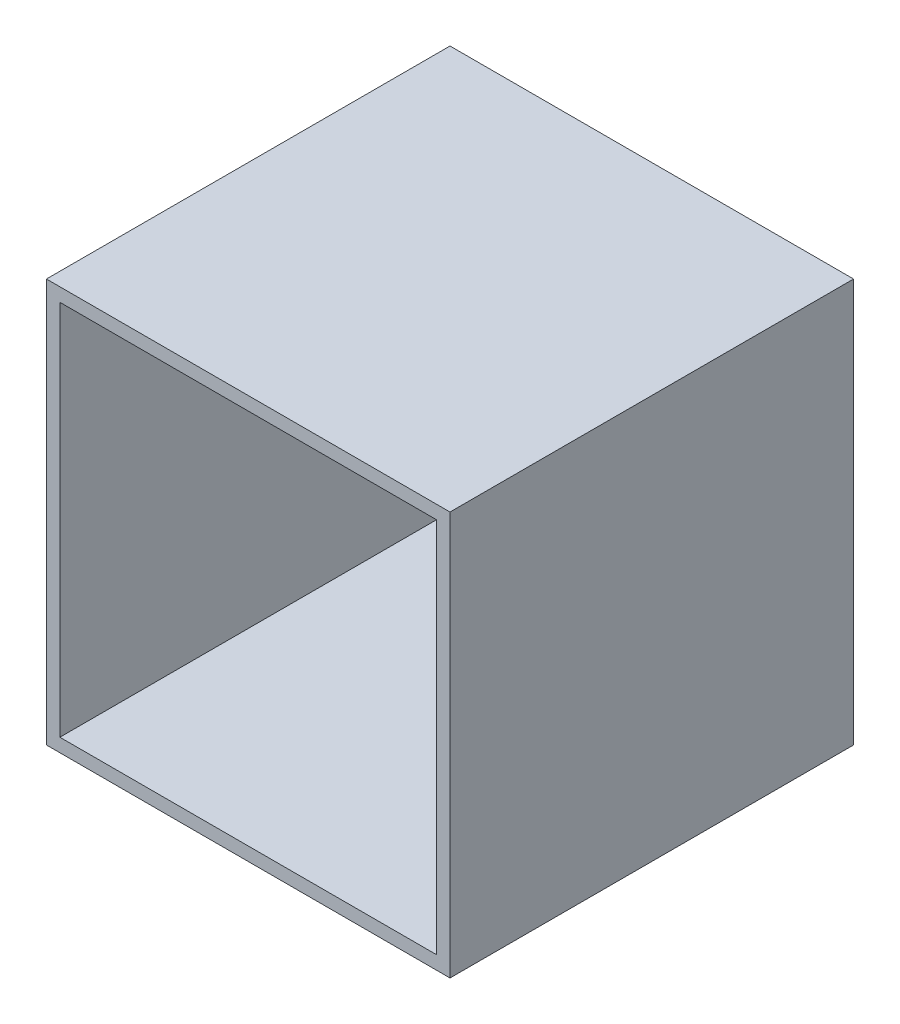
ISO-10303-21;
HEADER;
FILE_DESCRIPTION(('STEP AP214'),'2;1');
FILE_NAME('part.step','',(''),(''),'','','');
FILE_SCHEMA(('AUTOMOTIVE_DESIGN { 1 0 10303 214 1 1 1 1 }'));
ENDSEC;
DATA;
#1=APPLICATION_CONTEXT('core data for automotive mechanical design processes');
#2=APPLICATION_PROTOCOL_DEFINITION('international standard','automotive_design',2000,#1);
#3=PRODUCT_CONTEXT('',#1,'mechanical');
#4=PRODUCT('Part','Part','',(#3));
#5=PRODUCT_RELATED_PRODUCT_CATEGORY('part','',(#4));
#6=PRODUCT_DEFINITION_FORMATION('','',#4);
#7=PRODUCT_DEFINITION_CONTEXT('part definition',#1,'design');
#8=PRODUCT_DEFINITION('design','',#6,#7);
#9=PRODUCT_DEFINITION_SHAPE('','',#8);
#10=(LENGTH_UNIT() NAMED_UNIT(*) SI_UNIT(.MILLI.,.METRE.));
#11=(NAMED_UNIT(*) PLANE_ANGLE_UNIT() SI_UNIT($,.RADIAN.));
#12=(NAMED_UNIT(*) SI_UNIT($,.STERADIAN.) SOLID_ANGLE_UNIT());
#13=UNCERTAINTY_MEASURE_WITH_UNIT(LENGTH_MEASURE(1.E-05),#10,'distance_accuracy_value','');
#14=(GEOMETRIC_REPRESENTATION_CONTEXT(3) GLOBAL_UNCERTAINTY_ASSIGNED_CONTEXT((#13)) GLOBAL_UNIT_ASSIGNED_CONTEXT((#10,
#11,#12)) REPRESENTATION_CONTEXT('',''));
#15=CARTESIAN_POINT('',(0.,0.,0.));
#16=DIRECTION('',(0.,0.,1.));
#17=DIRECTION('',(1.,0.,0.));
#18=AXIS2_PLACEMENT_3D('',#15,#16,#17);
#19=CARTESIAN_POINT('',(-38.1,76.2,38.1));
#20=DIRECTION('',(0.,0.,-1.));
#21=DIRECTION('',(-1.,0.,0.));
#22=AXIS2_PLACEMENT_3D('',#19,#20,#21);
#23=PLANE('',#22);
#24=DIRECTION('',(1.,0.,0.));
#25=VECTOR('',#24,1.);
#26=CARTESIAN_POINT('',(-38.1,0.,38.1));
#27=LINE('',#26,#25);
#28=CARTESIAN_POINT('',(-38.1,0.,38.1));
#29=VERTEX_POINT('',#28);
#30=CARTESIAN_POINT('',(38.1,0.,38.1));
#31=VERTEX_POINT('',#30);
#32=EDGE_CURVE('E380',#29,#31,#27,.T.);
#33=ORIENTED_EDGE('',*,*,#32,.T.);
#34=DIRECTION('',(0.,-1.,0.));
#35=VECTOR('',#34,1.);
#36=CARTESIAN_POINT('',(38.1,76.2,38.1));
#37=LINE('',#36,#35);
#38=CARTESIAN_POINT('',(38.1,76.2,38.1));
#39=VERTEX_POINT('',#38);
#40=EDGE_CURVE('E386',#39,#31,#37,.T.);
#41=ORIENTED_EDGE('',*,*,#40,.F.);
#42=DIRECTION('',(1.,0.,0.));
#43=VECTOR('',#42,1.);
#44=CARTESIAN_POINT('',(-38.1,76.2,38.1));
#45=LINE('',#44,#43);
#46=CARTESIAN_POINT('',(-38.1,76.2,38.1));
#47=VERTEX_POINT('',#46);
#48=EDGE_CURVE('E384',#47,#39,#45,.T.);
#49=ORIENTED_EDGE('',*,*,#48,.F.);
#50=DIRECTION('',(0.,-1.,0.));
#51=VECTOR('',#50,1.);
#52=CARTESIAN_POINT('',(-38.1,76.2,38.1));
#53=LINE('',#52,#51);
#54=EDGE_CURVE('E396',#47,#29,#53,.T.);
#55=ORIENTED_EDGE('',*,*,#54,.T.);
#56=EDGE_LOOP('',(#33,#41,#49,#55));
#57=FACE_BOUND('',#56,.T.);
#58=DIRECTION('',(1.,0.,0.));
#59=VECTOR('',#58,1.);
#60=CARTESIAN_POINT('',(0.,2.54,38.1));
#61=LINE('',#60,#59);
#62=CARTESIAN_POINT('',(-35.56,2.54,38.1));
#63=VERTEX_POINT('',#62);
#64=CARTESIAN_POINT('',(35.56,2.54,38.1));
#65=VERTEX_POINT('',#64);
#66=EDGE_CURVE('E356',#63,#65,#61,.T.);
#67=ORIENTED_EDGE('',*,*,#66,.F.);
#68=DIRECTION('',(0.,-1.,0.));
#69=VECTOR('',#68,1.);
#70=CARTESIAN_POINT('',(-35.56,76.2,38.1));
#71=LINE('',#70,#69);
#72=CARTESIAN_POINT('',(-35.56,73.66,38.1));
#73=VERTEX_POINT('',#72);
#74=EDGE_CURVE('E361',#73,#63,#71,.T.);
#75=ORIENTED_EDGE('',*,*,#74,.F.);
#76=DIRECTION('',(1.,0.,0.));
#77=VECTOR('',#76,1.);
#78=CARTESIAN_POINT('',(0.,73.66,38.1));
#79=LINE('',#78,#77);
#80=CARTESIAN_POINT('',(35.56,73.66,38.1));
#81=VERTEX_POINT('',#80);
#82=EDGE_CURVE('E367',#73,#81,#79,.T.);
#83=ORIENTED_EDGE('',*,*,#82,.T.);
#84=DIRECTION('',(0.,-1.,0.));
#85=VECTOR('',#84,1.);
#86=CARTESIAN_POINT('',(35.56,76.2,38.1));
#87=LINE('',#86,#85);
#88=EDGE_CURVE('E368',#81,#65,#87,.T.);
#89=ORIENTED_EDGE('',*,*,#88,.T.);
#90=EDGE_LOOP('',(#67,#75,#83,#89));
#91=FACE_BOUND('',#90,.T.);
#92=ADVANCED_FACE('F33',(#57,#91),#23,.F.);
#93=CARTESIAN_POINT('',(38.1,76.2,38.1));
#94=DIRECTION('',(-1.,0.,0.));
#95=DIRECTION('',(0.,0.,1.));
#96=AXIS2_PLACEMENT_3D('',#93,#94,#95);
#97=PLANE('',#96);
#98=DIRECTION('',(0.,0.,-1.));
#99=VECTOR('',#98,1.);
#100=CARTESIAN_POINT('',(38.1,0.,38.1));
#101=LINE('',#100,#99);
#102=CARTESIAN_POINT('',(38.1,0.,-38.1));
#103=VERTEX_POINT('',#102);
#104=EDGE_CURVE('E350',#31,#103,#101,.T.);
#105=ORIENTED_EDGE('',*,*,#104,.T.);
#106=DIRECTION('',(0.,-1.,0.));
#107=VECTOR('',#106,1.);
#108=CARTESIAN_POINT('',(38.1,76.2,-38.1));
#109=LINE('',#108,#107);
#110=CARTESIAN_POINT('',(38.1,76.2,-38.1));
#111=VERTEX_POINT('',#110);
#112=EDGE_CURVE('E11',#111,#103,#109,.T.);
#113=ORIENTED_EDGE('',*,*,#112,.F.);
#114=DIRECTION('',(0.,0.,-1.));
#115=VECTOR('',#114,1.);
#116=CARTESIAN_POINT('',(38.1,76.2,38.1));
#117=LINE('',#116,#115);
#118=EDGE_CURVE('E376',#39,#111,#117,.T.);
#119=ORIENTED_EDGE('',*,*,#118,.F.);
#120=ORIENTED_EDGE('',*,*,#40,.T.);
#121=EDGE_LOOP('',(#105,#113,#119,#120));
#122=FACE_BOUND('',#121,.T.);
#123=ADVANCED_FACE('F35',(#122),#97,.F.);
#124=CARTESIAN_POINT('',(-38.1,76.2,-38.1));
#125=DIRECTION('',(0.,0.,1.));
#126=DIRECTION('',(1.,0.,0.));
#127=AXIS2_PLACEMENT_3D('',#124,#125,#126);
#128=PLANE('',#127);
#129=CARTESIAN_POINT('',(-21.336,43.0506780316477,-38.1));
#130=DIRECTION('',(0.,0.,-1.));
#131=DIRECTION('',(-1.,0.,0.));
#132=AXIS2_PLACEMENT_3D('',#129,#130,#131);
#133=CIRCLE('',#132,12.7);
#134=CARTESIAN_POINT('',(-34.036,43.0506780316477,-38.1));
#135=VERTEX_POINT('',#134);
#136=EDGE_CURVE('E569',#135,#135,#133,.T.);
#137=ORIENTED_EDGE('',*,*,#136,.F.);
#138=EDGE_LOOP('',(#137));
#139=FACE_BOUND('',#138,.T.);
#140=DIRECTION('',(0.,-1.,0.));
#141=VECTOR('',#140,1.);
#142=CARTESIAN_POINT('',(9.64770580411888,19.05,-38.1));
#143=LINE('',#142,#141);
#144=CARTESIAN_POINT('',(9.64770580411888,25.4,-38.1));
#145=VERTEX_POINT('',#144);
#146=CARTESIAN_POINT('',(9.64770580411888,19.05,-38.1));
#147=VERTEX_POINT('',#146);
#148=EDGE_CURVE('E251',#145,#147,#143,.T.);
#149=ORIENTED_EDGE('',*,*,#148,.F.);
#150=DIRECTION('',(1.,0.,0.));
#151=VECTOR('',#150,1.);
#152=CARTESIAN_POINT('',(9.64770580411888,25.4,-38.1));
#153=LINE('',#152,#151);
#154=CARTESIAN_POINT('',(3.29770580411888,25.4,-38.1));
#155=VERTEX_POINT('',#154);
#156=EDGE_CURVE('E48',#155,#145,#153,.T.);
#157=ORIENTED_EDGE('',*,*,#156,.F.);
#158=DIRECTION('',(0.,-1.,0.));
#159=VECTOR('',#158,1.);
#160=CARTESIAN_POINT('',(3.29770580411888,25.4,-38.1));
#161=LINE('',#160,#159);
#162=CARTESIAN_POINT('',(3.29770580411888,31.75,-38.1));
#163=VERTEX_POINT('',#162);
#164=EDGE_CURVE('E216',#163,#155,#161,.T.);
#165=ORIENTED_EDGE('',*,*,#164,.F.);
#166=DIRECTION('',(1.,0.,0.));
#167=VECTOR('',#166,1.);
#168=CARTESIAN_POINT('',(3.29770580411888,31.75,-38.1));
#169=LINE('',#168,#167);
#170=CARTESIAN_POINT('',(-3.05229419588112,31.75,-38.1));
#171=VERTEX_POINT('',#170);
#172=EDGE_CURVE('E219',#171,#163,#169,.T.);
#173=ORIENTED_EDGE('',*,*,#172,.F.);
#174=DIRECTION('',(0.,1.,0.));
#175=VECTOR('',#174,1.);
#176=CARTESIAN_POINT('',(-3.05229419588112,31.75,-38.1));
#177=LINE('',#176,#175);
#178=CARTESIAN_POINT('',(-3.05229419588112,25.4,-38.1));
#179=VERTEX_POINT('',#178);
#180=EDGE_CURVE('E275',#179,#171,#177,.T.);
#181=ORIENTED_EDGE('',*,*,#180,.F.);
#182=DIRECTION('',(1.,0.,0.));
#183=VECTOR('',#182,1.);
#184=CARTESIAN_POINT('',(-3.05229419588112,25.4,-38.1));
#185=LINE('',#184,#183);
#186=CARTESIAN_POINT('',(-9.40229419588112,25.4,-38.1));
#187=VERTEX_POINT('',#186);
#188=EDGE_CURVE('E272',#187,#179,#185,.T.);
#189=ORIENTED_EDGE('',*,*,#188,.F.);
#190=DIRECTION('',(0.,1.,0.));
#191=VECTOR('',#190,1.);
#192=CARTESIAN_POINT('',(-9.40229419588112,25.4,-38.1));
#193=LINE('',#192,#191);
#194=CARTESIAN_POINT('',(-9.40229419588112,19.05,-38.1));
#195=VERTEX_POINT('',#194);
#196=EDGE_CURVE('E269',#195,#187,#193,.T.);
#197=ORIENTED_EDGE('',*,*,#196,.F.);
#198=DIRECTION('',(-1.,0.,0.));
#199=VECTOR('',#198,1.);
#200=CARTESIAN_POINT('',(-9.40229419588112,19.05,-38.1));
#201=LINE('',#200,#199);
#202=CARTESIAN_POINT('',(-3.05229419588112,19.05,-38.1));
#203=VERTEX_POINT('',#202);
#204=EDGE_CURVE('E266',#203,#195,#201,.T.);
#205=ORIENTED_EDGE('',*,*,#204,.F.);
#206=DIRECTION('',(0.,1.,0.));
#207=VECTOR('',#206,1.);
#208=CARTESIAN_POINT('',(-3.05229419588112,19.05,-38.1));
#209=LINE('',#208,#207);
#210=CARTESIAN_POINT('',(-3.05229419588112,12.7,-38.1));
#211=VERTEX_POINT('',#210);
#212=EDGE_CURVE('E263',#211,#203,#209,.T.);
#213=ORIENTED_EDGE('',*,*,#212,.F.);
#214=DIRECTION('',(-1.,0.,0.));
#215=VECTOR('',#214,1.);
#216=CARTESIAN_POINT('',(-3.05229419588112,12.7,-38.1));
#217=LINE('',#216,#215);
#218=CARTESIAN_POINT('',(3.29770580411888,12.7,-38.1));
#219=VERTEX_POINT('',#218);
#220=EDGE_CURVE('E260',#219,#211,#217,.T.);
#221=ORIENTED_EDGE('',*,*,#220,.F.);
#222=DIRECTION('',(0.,-1.,0.));
#223=VECTOR('',#222,1.);
#224=CARTESIAN_POINT('',(3.29770580411888,12.7,-38.1));
#225=LINE('',#224,#223);
#226=CARTESIAN_POINT('',(3.29770580411888,19.05,-38.1));
#227=VERTEX_POINT('',#226);
#228=EDGE_CURVE('E257',#227,#219,#225,.T.);
#229=ORIENTED_EDGE('',*,*,#228,.F.);
#230=DIRECTION('',(-1.,0.,0.));
#231=VECTOR('',#230,1.);
#232=CARTESIAN_POINT('',(3.29770580411888,19.05,-38.1));
#233=LINE('',#232,#231);
#234=EDGE_CURVE('E254',#147,#227,#233,.T.);
#235=ORIENTED_EDGE('',*,*,#234,.F.);
#236=EDGE_LOOP('',(#149,#157,#165,#173,#181,#189,#197,#205,#213,#221,#229,#235));
#237=FACE_BOUND('',#236,.T.);
#238=CARTESIAN_POINT('',(0.,57.15,-38.1));
#239=DIRECTION('',(0.,0.,-1.));
#240=DIRECTION('',(-1.,0.,0.));
#241=AXIS2_PLACEMENT_3D('',#238,#239,#240);
#242=CIRCLE('',#241,6.35);
#243=CARTESIAN_POINT('',(-6.35,57.15,-38.1));
#244=VERTEX_POINT('',#243);
#245=EDGE_CURVE('E305',#244,#244,#242,.T.);
#246=ORIENTED_EDGE('',*,*,#245,.F.);
#247=EDGE_LOOP('',(#246));
#248=FACE_BOUND('',#247,.T.);
#249=DIRECTION('',(0.,1.,0.));
#250=VECTOR('',#249,1.);
#251=CARTESIAN_POINT('',(21.59,69.85,-38.1));
#252=LINE('',#251,#250);
#253=CARTESIAN_POINT('',(21.59,6.35000000000001,-38.1));
#254=VERTEX_POINT('',#253);
#255=CARTESIAN_POINT('',(21.59,69.85,-38.1));
#256=VERTEX_POINT('',#255);
#257=EDGE_CURVE('E316',#254,#256,#252,.T.);
#258=ORIENTED_EDGE('',*,*,#257,.F.);
#259=DIRECTION('',(-1.,0.,0.));
#260=VECTOR('',#259,1.);
#261=CARTESIAN_POINT('',(27.94,6.35000000000001,-38.1));
#262=LINE('',#261,#260);
#263=CARTESIAN_POINT('',(27.94,6.35000000000001,-38.1));
#264=VERTEX_POINT('',#263);
#265=EDGE_CURVE('E319',#264,#254,#262,.T.);
#266=ORIENTED_EDGE('',*,*,#265,.F.);
#267=DIRECTION('',(0.,-1.,0.));
#268=VECTOR('',#267,1.);
#269=CARTESIAN_POINT('',(27.94,69.85,-38.1));
#270=LINE('',#269,#268);
#271=CARTESIAN_POINT('',(27.94,69.85,-38.1));
#272=VERTEX_POINT('',#271);
#273=EDGE_CURVE('E311',#272,#264,#270,.T.);
#274=ORIENTED_EDGE('',*,*,#273,.F.);
#275=DIRECTION('',(1.,0.,0.));
#276=VECTOR('',#275,1.);
#277=CARTESIAN_POINT('',(27.94,69.85,-38.1));
#278=LINE('',#277,#276);
#279=EDGE_CURVE('E56',#256,#272,#278,.T.);
#280=ORIENTED_EDGE('',*,*,#279,.F.);
#281=EDGE_LOOP('',(#258,#266,#274,#280));
#282=FACE_BOUND('',#281,.T.);
#283=DIRECTION('',(-1.,0.,0.));
#284=VECTOR('',#283,1.);
#285=CARTESIAN_POINT('',(-38.1,0.,-38.1));
#286=LINE('',#285,#284);
#287=CARTESIAN_POINT('',(-38.1,0.,-38.1));
#288=VERTEX_POINT('',#287);
#289=EDGE_CURVE('E389',#103,#288,#286,.T.);
#290=ORIENTED_EDGE('',*,*,#289,.T.);
#291=DIRECTION('',(0.,-1.,0.));
#292=VECTOR('',#291,1.);
#293=CARTESIAN_POINT('',(-38.1,76.2,-38.1));
#294=LINE('',#293,#292);
#295=CARTESIAN_POINT('',(-38.1,76.2,-38.1));
#296=VERTEX_POINT('',#295);
#297=EDGE_CURVE('E41',#296,#288,#294,.T.);
#298=ORIENTED_EDGE('',*,*,#297,.F.);
#299=DIRECTION('',(-1.,0.,0.));
#300=VECTOR('',#299,1.);
#301=CARTESIAN_POINT('',(-38.1,76.2,-38.1));
#302=LINE('',#301,#300);
#303=EDGE_CURVE('E379',#111,#296,#302,.T.);
#304=ORIENTED_EDGE('',*,*,#303,.F.);
#305=ORIENTED_EDGE('',*,*,#112,.T.);
#306=EDGE_LOOP('',(#290,#298,#304,#305));
#307=FACE_BOUND('',#306,.T.);
#308=ADVANCED_FACE('F419',(#139,#237,#248,#282,#307),#128,.F.);
#309=CARTESIAN_POINT('',(-38.1,76.2,38.1));
#310=DIRECTION('',(1.,0.,0.));
#311=DIRECTION('',(0.,0.,-1.));
#312=AXIS2_PLACEMENT_3D('',#309,#310,#311);
#313=PLANE('',#312);
#314=DIRECTION('',(0.,0.,1.));
#315=VECTOR('',#314,1.);
#316=CARTESIAN_POINT('',(-38.1,0.,38.1));
#317=LINE('',#316,#315);
#318=EDGE_CURVE('E391',#288,#29,#317,.T.);
#319=ORIENTED_EDGE('',*,*,#318,.T.);
#320=ORIENTED_EDGE('',*,*,#54,.F.);
#321=DIRECTION('',(0.,0.,1.));
#322=VECTOR('',#321,1.);
#323=CARTESIAN_POINT('',(-38.1,76.2,38.1));
#324=LINE('',#323,#322);
#325=EDGE_CURVE('E382',#296,#47,#324,.T.);
#326=ORIENTED_EDGE('',*,*,#325,.F.);
#327=ORIENTED_EDGE('',*,*,#297,.T.);
#328=EDGE_LOOP('',(#319,#320,#326,#327));
#329=FACE_BOUND('',#328,.T.);
#330=ADVANCED_FACE('F403',(#329),#313,.F.);
#331=CARTESIAN_POINT('',(0.,76.2,0.));
#332=DIRECTION('',(0.,-1.,0.));
#333=DIRECTION('',(0.,0.,-1.));
#334=AXIS2_PLACEMENT_3D('',#331,#332,#333);
#335=PLANE('',#334);
#336=ORIENTED_EDGE('',*,*,#118,.T.);
#337=ORIENTED_EDGE('',*,*,#303,.T.);
#338=ORIENTED_EDGE('',*,*,#325,.T.);
#339=ORIENTED_EDGE('',*,*,#48,.T.);
#340=EDGE_LOOP('',(#336,#337,#338,#339));
#341=FACE_BOUND('',#340,.T.);
#342=ADVANCED_FACE('F418',(#341),#335,.F.);
#343=CARTESIAN_POINT('',(0.,0.,0.));
#344=DIRECTION('',(0.,-1.,0.));
#345=DIRECTION('',(0.,0.,-1.));
#346=AXIS2_PLACEMENT_3D('',#343,#344,#345);
#347=PLANE('',#346);
#348=ORIENTED_EDGE('',*,*,#104,.F.);
#349=ORIENTED_EDGE('',*,*,#32,.F.);
#350=ORIENTED_EDGE('',*,*,#318,.F.);
#351=ORIENTED_EDGE('',*,*,#289,.F.);
#352=EDGE_LOOP('',(#348,#349,#350,#351));
#353=FACE_BOUND('',#352,.T.);
#354=ADVANCED_FACE('F409',(#353),#347,.T.);
#355=CARTESIAN_POINT('',(35.56,76.2,38.1));
#356=DIRECTION('',(-1.,0.,0.));
#357=DIRECTION('',(0.,0.,1.));
#358=AXIS2_PLACEMENT_3D('',#355,#356,#357);
#359=PLANE('',#358);
#360=DIRECTION('',(0.,0.,-1.));
#361=VECTOR('',#360,1.);
#362=CARTESIAN_POINT('',(35.56,2.54,0.));
#363=LINE('',#362,#361);
#364=CARTESIAN_POINT('',(35.56,2.54,-35.56));
#365=VERTEX_POINT('',#364);
#366=EDGE_CURVE('E343',#65,#365,#363,.T.);
#367=ORIENTED_EDGE('',*,*,#366,.F.);
#368=ORIENTED_EDGE('',*,*,#88,.F.);
#369=DIRECTION('',(0.,0.,-1.));
#370=VECTOR('',#369,1.);
#371=CARTESIAN_POINT('',(35.56,73.66,0.));
#372=LINE('',#371,#370);
#373=CARTESIAN_POINT('',(35.56,73.66,-35.56));
#374=VERTEX_POINT('',#373);
#375=EDGE_CURVE('E352',#81,#374,#372,.T.);
#376=ORIENTED_EDGE('',*,*,#375,.T.);
#377=DIRECTION('',(0.,-1.,0.));
#378=VECTOR('',#377,1.);
#379=CARTESIAN_POINT('',(35.56,76.2,-35.56));
#380=LINE('',#379,#378);
#381=EDGE_CURVE('E347',#374,#365,#380,.T.);
#382=ORIENTED_EDGE('',*,*,#381,.T.);
#383=EDGE_LOOP('',(#367,#368,#376,#382));
#384=FACE_BOUND('',#383,.T.);
#385=ADVANCED_FACE('F436',(#384),#359,.T.);
#386=CARTESIAN_POINT('',(-38.1,76.2,-35.56));
#387=DIRECTION('',(0.,0.,1.));
#388=DIRECTION('',(1.,0.,0.));
#389=AXIS2_PLACEMENT_3D('',#386,#387,#388);
#390=PLANE('',#389);
#391=CARTESIAN_POINT('',(-21.336,43.0506780316477,-35.56));
#392=DIRECTION('',(0.,0.,-1.));
#393=DIRECTION('',(-1.,0.,0.));
#394=AXIS2_PLACEMENT_3D('',#391,#392,#393);
#395=CIRCLE('',#394,3.175);
#396=CARTESIAN_POINT('',(-24.511,43.0506780316477,-35.56));
#397=VERTEX_POINT('',#396);
#398=EDGE_CURVE('E564',#397,#397,#395,.T.);
#399=ORIENTED_EDGE('',*,*,#398,.T.);
#400=EDGE_LOOP('',(#399));
#401=FACE_BOUND('',#400,.T.);
#402=CARTESIAN_POINT('',(6.47270580411888,22.225,-35.56));
#403=DIRECTION('',(0.,0.,-1.));
#404=DIRECTION('',(-1.,0.,0.));
#405=AXIS2_PLACEMENT_3D('',#402,#403,#404);
#406=CIRCLE('',#405,1.397);
#407=CARTESIAN_POINT('',(5.07570580411888,22.225,-35.56));
#408=VERTEX_POINT('',#407);
#409=EDGE_CURVE('E578',#408,#408,#406,.T.);
#410=ORIENTED_EDGE('',*,*,#409,.T.);
#411=EDGE_LOOP('',(#410));
#412=FACE_BOUND('',#411,.T.);
#413=CARTESIAN_POINT('',(0.122705804118876,15.875,-35.56));
#414=DIRECTION('',(0.,0.,-1.));
#415=DIRECTION('',(-1.,0.,0.));
#416=AXIS2_PLACEMENT_3D('',#413,#414,#415);
#417=CIRCLE('',#416,1.397);
#418=CARTESIAN_POINT('',(-1.27429419588112,15.875,-35.56));
#419=VERTEX_POINT('',#418);
#420=EDGE_CURVE('E584',#419,#419,#417,.T.);
#421=ORIENTED_EDGE('',*,*,#420,.T.);
#422=EDGE_LOOP('',(#421));
#423=FACE_BOUND('',#422,.T.);
#424=CARTESIAN_POINT('',(-6.22729419588112,22.225,-35.56));
#425=DIRECTION('',(0.,0.,-1.));
#426=DIRECTION('',(-1.,0.,0.));
#427=AXIS2_PLACEMENT_3D('',#424,#425,#426);
#428=CIRCLE('',#427,1.397);
#429=CARTESIAN_POINT('',(-7.62429419588112,22.225,-35.56));
#430=VERTEX_POINT('',#429);
#431=EDGE_CURVE('E590',#430,#430,#428,.T.);
#432=ORIENTED_EDGE('',*,*,#431,.T.);
#433=EDGE_LOOP('',(#432));
#434=FACE_BOUND('',#433,.T.);
#435=CARTESIAN_POINT('',(0.122705804118876,28.575,-35.56));
#436=DIRECTION('',(0.,0.,-1.));
#437=DIRECTION('',(-1.,0.,0.));
#438=AXIS2_PLACEMENT_3D('',#435,#436,#437);
#439=CIRCLE('',#438,1.397);
#440=CARTESIAN_POINT('',(-1.27429419588112,28.575,-35.56));
#441=VERTEX_POINT('',#440);
#442=EDGE_CURVE('E252',#441,#441,#439,.T.);
#443=ORIENTED_EDGE('',*,*,#442,.T.);
#444=EDGE_LOOP('',(#443));
#445=FACE_BOUND('',#444,.T.);
#446=CARTESIAN_POINT('',(0.,57.15,-35.56));
#447=DIRECTION('',(0.,0.,-1.));
#448=DIRECTION('',(-1.,0.,0.));
#449=AXIS2_PLACEMENT_3D('',#446,#447,#448);
#450=CIRCLE('',#449,3.175);
#451=CARTESIAN_POINT('',(-3.175,57.15,-35.56));
#452=VERTEX_POINT('',#451);
#453=EDGE_CURVE('E302',#452,#452,#450,.T.);
#454=ORIENTED_EDGE('',*,*,#453,.T.);
#455=EDGE_LOOP('',(#454));
#456=FACE_BOUND('',#455,.T.);
#457=DIRECTION('',(-1.,0.,0.));
#458=VECTOR('',#457,1.);
#459=CARTESIAN_POINT('',(27.94,6.35000000000001,-35.56));
#460=LINE('',#459,#458);
#461=CARTESIAN_POINT('',(27.94,6.35000000000001,-35.56));
#462=VERTEX_POINT('',#461);
#463=CARTESIAN_POINT('',(21.59,6.35000000000001,-35.56));
#464=VERTEX_POINT('',#463);
#465=EDGE_CURVE('E315',#462,#464,#460,.T.);
#466=ORIENTED_EDGE('',*,*,#465,.T.);
#467=DIRECTION('',(0.,1.,0.));
#468=VECTOR('',#467,1.);
#469=CARTESIAN_POINT('',(21.59,69.85,-35.56));
#470=LINE('',#469,#468);
#471=CARTESIAN_POINT('',(21.59,69.85,-35.56));
#472=VERTEX_POINT('',#471);
#473=EDGE_CURVE('E336',#464,#472,#470,.T.);
#474=ORIENTED_EDGE('',*,*,#473,.T.);
#475=DIRECTION('',(1.,0.,0.));
#476=VECTOR('',#475,1.);
#477=CARTESIAN_POINT('',(27.94,69.85,-35.56));
#478=LINE('',#477,#476);
#479=CARTESIAN_POINT('',(27.94,69.85,-35.56));
#480=VERTEX_POINT('',#479);
#481=EDGE_CURVE('E332',#472,#480,#478,.T.);
#482=ORIENTED_EDGE('',*,*,#481,.T.);
#483=DIRECTION('',(0.,-1.,0.));
#484=VECTOR('',#483,1.);
#485=CARTESIAN_POINT('',(27.94,69.85,-35.56));
#486=LINE('',#485,#484);
#487=EDGE_CURVE('E327',#480,#462,#486,.T.);
#488=ORIENTED_EDGE('',*,*,#487,.T.);
#489=EDGE_LOOP('',(#466,#474,#482,#488));
#490=FACE_BOUND('',#489,.T.);
#491=DIRECTION('',(-1.,0.,0.));
#492=VECTOR('',#491,1.);
#493=CARTESIAN_POINT('',(0.,2.54,-35.56));
#494=LINE('',#493,#492);
#495=CARTESIAN_POINT('',(-35.56,2.54,-35.56));
#496=VERTEX_POINT('',#495);
#497=EDGE_CURVE('E346',#365,#496,#494,.T.);
#498=ORIENTED_EDGE('',*,*,#497,.F.);
#499=ORIENTED_EDGE('',*,*,#381,.F.);
#500=DIRECTION('',(-1.,0.,0.));
#501=VECTOR('',#500,1.);
#502=CARTESIAN_POINT('',(0.,73.66,-35.56));
#503=LINE('',#502,#501);
#504=CARTESIAN_POINT('',(-35.56,73.66,-35.56));
#505=VERTEX_POINT('',#504);
#506=EDGE_CURVE('E355',#374,#505,#503,.T.);
#507=ORIENTED_EDGE('',*,*,#506,.T.);
#508=DIRECTION('',(0.,-1.,0.));
#509=VECTOR('',#508,1.);
#510=CARTESIAN_POINT('',(-35.56,76.2,-35.56));
#511=LINE('',#510,#509);
#512=EDGE_CURVE('E351',#505,#496,#511,.T.);
#513=ORIENTED_EDGE('',*,*,#512,.T.);
#514=EDGE_LOOP('',(#498,#499,#507,#513));
#515=FACE_BOUND('',#514,.T.);
#516=ADVANCED_FACE('F451',(#401,#412,#423,#434,#445,#456,#490,#515),#390,.T.);
#517=CARTESIAN_POINT('',(-35.56,76.2,38.1));
#518=DIRECTION('',(1.,0.,0.));
#519=DIRECTION('',(0.,0.,-1.));
#520=AXIS2_PLACEMENT_3D('',#517,#518,#519);
#521=PLANE('',#520);
#522=DIRECTION('',(0.,0.,1.));
#523=VECTOR('',#522,1.);
#524=CARTESIAN_POINT('',(-35.56,2.54,0.));
#525=LINE('',#524,#523);
#526=EDGE_CURVE('E358',#496,#63,#525,.T.);
#527=ORIENTED_EDGE('',*,*,#526,.F.);
#528=ORIENTED_EDGE('',*,*,#512,.F.);
#529=DIRECTION('',(0.,0.,1.));
#530=VECTOR('',#529,1.);
#531=CARTESIAN_POINT('',(-35.56,73.66,0.));
#532=LINE('',#531,#530);
#533=EDGE_CURVE('E363',#505,#73,#532,.T.);
#534=ORIENTED_EDGE('',*,*,#533,.T.);
#535=ORIENTED_EDGE('',*,*,#74,.T.);
#536=EDGE_LOOP('',(#527,#528,#534,#535));
#537=FACE_BOUND('',#536,.T.);
#538=ADVANCED_FACE('F447',(#537),#521,.T.);
#539=CARTESIAN_POINT('',(0.,73.66,0.));
#540=DIRECTION('',(0.,-1.,0.));
#541=DIRECTION('',(0.,0.,-1.));
#542=AXIS2_PLACEMENT_3D('',#539,#540,#541);
#543=PLANE('',#542);
#544=ORIENTED_EDGE('',*,*,#375,.F.);
#545=ORIENTED_EDGE('',*,*,#82,.F.);
#546=ORIENTED_EDGE('',*,*,#533,.F.);
#547=ORIENTED_EDGE('',*,*,#506,.F.);
#548=EDGE_LOOP('',(#544,#545,#546,#547));
#549=FACE_BOUND('',#548,.T.);
#550=ADVANCED_FACE('F443',(#549),#543,.T.);
#551=CARTESIAN_POINT('',(0.,2.54,0.));
#552=DIRECTION('',(0.,-1.,0.));
#553=DIRECTION('',(0.,0.,-1.));
#554=AXIS2_PLACEMENT_3D('',#551,#552,#553);
#555=PLANE('',#554);
#556=ORIENTED_EDGE('',*,*,#366,.T.);
#557=ORIENTED_EDGE('',*,*,#497,.T.);
#558=ORIENTED_EDGE('',*,*,#526,.T.);
#559=ORIENTED_EDGE('',*,*,#66,.T.);
#560=EDGE_LOOP('',(#556,#557,#558,#559));
#561=FACE_BOUND('',#560,.T.);
#562=ADVANCED_FACE('F439',(#561),#555,.F.);
#563=CARTESIAN_POINT('',(27.94,6.35000000000001,28.2567101941177));
#564=DIRECTION('',(0.,-1.,0.));
#565=DIRECTION('',(0.,0.,-1.));
#566=AXIS2_PLACEMENT_3D('',#563,#564,#565);
#567=PLANE('',#566);
#568=DIRECTION('',(0.,0.,-1.));
#569=VECTOR('',#568,1.);
#570=CARTESIAN_POINT('',(27.94,6.35000000000001,28.2567101941177));
#571=LINE('',#570,#569);
#572=EDGE_CURVE('E330',#462,#264,#571,.T.);
#573=ORIENTED_EDGE('',*,*,#572,.T.);
#574=ORIENTED_EDGE('',*,*,#265,.T.);
#575=DIRECTION('',(0.,0.,-1.));
#576=VECTOR('',#575,1.);
#577=CARTESIAN_POINT('',(21.59,6.35000000000001,28.2567101941177));
#578=LINE('',#577,#576);
#579=EDGE_CURVE('E326',#464,#254,#578,.T.);
#580=ORIENTED_EDGE('',*,*,#579,.F.);
#581=ORIENTED_EDGE('',*,*,#465,.F.);
#582=EDGE_LOOP('',(#573,#574,#580,#581));
#583=FACE_BOUND('',#582,.T.);
#584=ADVANCED_FACE('F442',(#583),#567,.F.);
#585=CARTESIAN_POINT('',(21.59,69.85,28.2567101941177));
#586=DIRECTION('',(-1.,0.,0.));
#587=DIRECTION('',(0.,-1.,0.));
#588=AXIS2_PLACEMENT_3D('',#585,#586,#587);
#589=PLANE('',#588);
#590=ORIENTED_EDGE('',*,*,#579,.T.);
#591=ORIENTED_EDGE('',*,*,#257,.T.);
#592=DIRECTION('',(0.,0.,-1.));
#593=VECTOR('',#592,1.);
#594=CARTESIAN_POINT('',(21.59,69.85,28.2567101941177));
#595=LINE('',#594,#593);
#596=EDGE_CURVE('E335',#472,#256,#595,.T.);
#597=ORIENTED_EDGE('',*,*,#596,.F.);
#598=ORIENTED_EDGE('',*,*,#473,.F.);
#599=EDGE_LOOP('',(#590,#591,#597,#598));
#600=FACE_BOUND('',#599,.T.);
#601=ADVANCED_FACE('F461',(#600),#589,.F.);
#602=CARTESIAN_POINT('',(27.94,69.85,28.2567101941177));
#603=DIRECTION('',(0.,1.,0.));
#604=DIRECTION('',(0.,0.,1.));
#605=AXIS2_PLACEMENT_3D('',#602,#603,#604);
#606=PLANE('',#605);
#607=ORIENTED_EDGE('',*,*,#596,.T.);
#608=ORIENTED_EDGE('',*,*,#279,.T.);
#609=DIRECTION('',(0.,0.,-1.));
#610=VECTOR('',#609,1.);
#611=CARTESIAN_POINT('',(27.94,69.85,28.2567101941177));
#612=LINE('',#611,#610);
#613=EDGE_CURVE('E331',#480,#272,#612,.T.);
#614=ORIENTED_EDGE('',*,*,#613,.F.);
#615=ORIENTED_EDGE('',*,*,#481,.F.);
#616=EDGE_LOOP('',(#607,#608,#614,#615));
#617=FACE_BOUND('',#616,.T.);
#618=ADVANCED_FACE('F465',(#617),#606,.F.);
#619=CARTESIAN_POINT('',(27.94,69.85,28.2567101941177));
#620=DIRECTION('',(1.,0.,0.));
#621=DIRECTION('',(0.,1.,0.));
#622=AXIS2_PLACEMENT_3D('',#619,#620,#621);
#623=PLANE('',#622);
#624=ORIENTED_EDGE('',*,*,#613,.T.);
#625=ORIENTED_EDGE('',*,*,#273,.T.);
#626=ORIENTED_EDGE('',*,*,#572,.F.);
#627=ORIENTED_EDGE('',*,*,#487,.F.);
#628=EDGE_LOOP('',(#624,#625,#626,#627));
#629=FACE_BOUND('',#628,.T.);
#630=ADVANCED_FACE('F469',(#629),#623,.F.);
#631=CARTESIAN_POINT('',(0.,57.15,-36.83));
#632=DIRECTION('',(0.,0.,-1.));
#633=DIRECTION('',(-1.,0.,0.));
#634=AXIS2_PLACEMENT_3D('',#631,#632,#633);
#635=CYLINDRICAL_SURFACE('',#634,6.35);
#636=CARTESIAN_POINT('',(0.,57.15,-36.83));
#637=DIRECTION('',(0.,0.,-1.));
#638=DIRECTION('',(-1.,0.,0.));
#639=AXIS2_PLACEMENT_3D('',#636,#637,#638);
#640=CIRCLE('',#639,6.35);
#641=CARTESIAN_POINT('',(-6.35,57.15,-36.83));
#642=VERTEX_POINT('',#641);
#643=EDGE_CURVE('E308',#642,#642,#640,.T.);
#644=ORIENTED_EDGE('',*,*,#643,.F.);
#645=EDGE_LOOP('',(#644));
#646=FACE_BOUND('',#645,.T.);
#647=ORIENTED_EDGE('',*,*,#245,.T.);
#648=EDGE_LOOP('',(#647));
#649=FACE_BOUND('',#648,.T.);
#650=ADVANCED_FACE('F472',(#646,#649),#635,.F.);
#651=CARTESIAN_POINT('',(0.,57.15,-36.83));
#652=DIRECTION('',(0.,0.,-1.));
#653=DIRECTION('',(-1.,0.,0.));
#654=AXIS2_PLACEMENT_3D('',#651,#652,#653);
#655=PLANE('',#654);
#656=CARTESIAN_POINT('',(0.,57.15,-36.83));
#657=DIRECTION('',(0.,0.,-1.));
#658=DIRECTION('',(-1.,0.,0.));
#659=AXIS2_PLACEMENT_3D('',#656,#657,#658);
#660=CIRCLE('',#659,3.175);
#661=CARTESIAN_POINT('',(-3.175,57.15,-36.83));
#662=VERTEX_POINT('',#661);
#663=EDGE_CURVE('E282',#662,#662,#660,.T.);
#664=ORIENTED_EDGE('',*,*,#663,.F.);
#665=EDGE_LOOP('',(#664));
#666=FACE_BOUND('',#665,.T.);
#667=ORIENTED_EDGE('',*,*,#643,.T.);
#668=EDGE_LOOP('',(#667));
#669=FACE_BOUND('',#668,.T.);
#670=ADVANCED_FACE('F476',(#666,#669),#655,.T.);
#671=CARTESIAN_POINT('',(0.,57.15,-35.56));
#672=DIRECTION('',(0.,0.,-1.));
#673=DIRECTION('',(-1.,0.,0.));
#674=AXIS2_PLACEMENT_3D('',#671,#672,#673);
#675=CYLINDRICAL_SURFACE('',#674,3.175);
#676=ORIENTED_EDGE('',*,*,#453,.F.);
#677=EDGE_LOOP('',(#676));
#678=FACE_BOUND('',#677,.T.);
#679=ORIENTED_EDGE('',*,*,#663,.T.);
#680=EDGE_LOOP('',(#679));
#681=FACE_BOUND('',#680,.T.);
#682=ADVANCED_FACE('F480',(#678,#681),#675,.F.);
#683=CARTESIAN_POINT('',(9.64770580411888,25.4,-36.83));
#684=DIRECTION('',(0.,1.,0.));
#685=DIRECTION('',(0.,0.,1.));
#686=AXIS2_PLACEMENT_3D('',#683,#684,#685);
#687=PLANE('',#686);
#688=ORIENTED_EDGE('',*,*,#156,.T.);
#689=DIRECTION('',(0.,0.,-1.));
#690=VECTOR('',#689,1.);
#691=CARTESIAN_POINT('',(9.64770580411888,25.4,-36.83));
#692=LINE('',#691,#690);
#693=CARTESIAN_POINT('',(9.64770580411888,25.4,-36.83));
#694=VERTEX_POINT('',#693);
#695=EDGE_CURVE('E193',#694,#145,#692,.T.);
#696=ORIENTED_EDGE('',*,*,#695,.F.);
#697=DIRECTION('',(1.,0.,0.));
#698=VECTOR('',#697,1.);
#699=CARTESIAN_POINT('',(9.64770580411888,25.4,-36.83));
#700=LINE('',#699,#698);
#701=CARTESIAN_POINT('',(3.29770580411888,25.4,-36.83));
#702=VERTEX_POINT('',#701);
#703=EDGE_CURVE('E197',#702,#694,#700,.T.);
#704=ORIENTED_EDGE('',*,*,#703,.F.);
#705=DIRECTION('',(0.,0.,-1.));
#706=VECTOR('',#705,1.);
#707=CARTESIAN_POINT('',(3.29770580411888,25.4,-36.83));
#708=LINE('',#707,#706);
#709=EDGE_CURVE('E280',#702,#155,#708,.T.);
#710=ORIENTED_EDGE('',*,*,#709,.T.);
#711=EDGE_LOOP('',(#688,#696,#704,#710));
#712=FACE_BOUND('',#711,.T.);
#713=ADVANCED_FACE('F195',(#712),#687,.F.);
#714=CARTESIAN_POINT('',(3.29770580411888,25.4,-36.83));
#715=DIRECTION('',(1.,0.,0.));
#716=DIRECTION('',(0.,0.,-1.));
#717=AXIS2_PLACEMENT_3D('',#714,#715,#716);
#718=PLANE('',#717);
#719=ORIENTED_EDGE('',*,*,#164,.T.);
#720=ORIENTED_EDGE('',*,*,#709,.F.);
#721=DIRECTION('',(0.,-1.,0.));
#722=VECTOR('',#721,1.);
#723=CARTESIAN_POINT('',(3.29770580411888,25.4,-36.83));
#724=LINE('',#723,#722);
#725=CARTESIAN_POINT('',(3.29770580411888,31.75,-36.83));
#726=VERTEX_POINT('',#725);
#727=EDGE_CURVE('E203',#726,#702,#724,.T.);
#728=ORIENTED_EDGE('',*,*,#727,.F.);
#729=DIRECTION('',(0.,0.,-1.));
#730=VECTOR('',#729,1.);
#731=CARTESIAN_POINT('',(3.29770580411888,31.75,-36.83));
#732=LINE('',#731,#730);
#733=EDGE_CURVE('E283',#726,#163,#732,.T.);
#734=ORIENTED_EDGE('',*,*,#733,.T.);
#735=EDGE_LOOP('',(#719,#720,#728,#734));
#736=FACE_BOUND('',#735,.T.);
#737=ADVANCED_FACE('F487',(#736),#718,.F.);
#738=CARTESIAN_POINT('',(3.29770580411888,31.75,-36.83));
#739=DIRECTION('',(0.,1.,0.));
#740=DIRECTION('',(-1.,0.,0.));
#741=AXIS2_PLACEMENT_3D('',#738,#739,#740);
#742=PLANE('',#741);
#743=ORIENTED_EDGE('',*,*,#172,.T.);
#744=ORIENTED_EDGE('',*,*,#733,.F.);
#745=DIRECTION('',(1.,0.,0.));
#746=VECTOR('',#745,1.);
#747=CARTESIAN_POINT('',(3.29770580411888,31.75,-36.83));
#748=LINE('',#747,#746);
#749=CARTESIAN_POINT('',(-3.05229419588112,31.75,-36.83));
#750=VERTEX_POINT('',#749);
#751=EDGE_CURVE('E247',#750,#726,#748,.T.);
#752=ORIENTED_EDGE('',*,*,#751,.F.);
#753=DIRECTION('',(0.,0.,-1.));
#754=VECTOR('',#753,1.);
#755=CARTESIAN_POINT('',(-3.05229419588112,31.75,-36.83));
#756=LINE('',#755,#754);
#757=EDGE_CURVE('E285',#750,#171,#756,.T.);
#758=ORIENTED_EDGE('',*,*,#757,.T.);
#759=EDGE_LOOP('',(#743,#744,#752,#758));
#760=FACE_BOUND('',#759,.T.);
#761=ADVANCED_FACE('F521',(#760),#742,.F.);
#762=CARTESIAN_POINT('',(-3.05229419588112,31.75,-36.83));
#763=DIRECTION('',(-1.,0.,0.));
#764=DIRECTION('',(0.,-1.,0.));
#765=AXIS2_PLACEMENT_3D('',#762,#763,#764);
#766=PLANE('',#765);
#767=ORIENTED_EDGE('',*,*,#180,.T.);
#768=ORIENTED_EDGE('',*,*,#757,.F.);
#769=DIRECTION('',(0.,1.,0.));
#770=VECTOR('',#769,1.);
#771=CARTESIAN_POINT('',(-3.05229419588112,31.75,-36.83));
#772=LINE('',#771,#770);
#773=CARTESIAN_POINT('',(-3.05229419588112,25.4,-36.83));
#774=VERTEX_POINT('',#773);
#775=EDGE_CURVE('E244',#774,#750,#772,.T.);
#776=ORIENTED_EDGE('',*,*,#775,.F.);
#777=DIRECTION('',(0.,0.,-1.));
#778=VECTOR('',#777,1.);
#779=CARTESIAN_POINT('',(-3.05229419588112,25.4,-36.83));
#780=LINE('',#779,#778);
#781=EDGE_CURVE('E287',#774,#179,#780,.T.);
#782=ORIENTED_EDGE('',*,*,#781,.T.);
#783=EDGE_LOOP('',(#767,#768,#776,#782));
#784=FACE_BOUND('',#783,.T.);
#785=ADVANCED_FACE('F517',(#784),#766,.F.);
#786=CARTESIAN_POINT('',(-3.05229419588112,25.4,-36.83));
#787=DIRECTION('',(0.,1.,0.));
#788=DIRECTION('',(0.,0.,1.));
#789=AXIS2_PLACEMENT_3D('',#786,#787,#788);
#790=PLANE('',#789);
#791=ORIENTED_EDGE('',*,*,#188,.T.);
#792=ORIENTED_EDGE('',*,*,#781,.F.);
#793=DIRECTION('',(1.,0.,0.));
#794=VECTOR('',#793,1.);
#795=CARTESIAN_POINT('',(-3.05229419588112,25.4,-36.83));
#796=LINE('',#795,#794);
#797=CARTESIAN_POINT('',(-9.40229419588112,25.4,-36.83));
#798=VERTEX_POINT('',#797);
#799=EDGE_CURVE('E241',#798,#774,#796,.T.);
#800=ORIENTED_EDGE('',*,*,#799,.F.);
#801=DIRECTION('',(0.,0.,-1.));
#802=VECTOR('',#801,1.);
#803=CARTESIAN_POINT('',(-9.40229419588112,25.4,-36.83));
#804=LINE('',#803,#802);
#805=EDGE_CURVE('E289',#798,#187,#804,.T.);
#806=ORIENTED_EDGE('',*,*,#805,.T.);
#807=EDGE_LOOP('',(#791,#792,#800,#806));
#808=FACE_BOUND('',#807,.T.);
#809=ADVANCED_FACE('F513',(#808),#790,.F.);
#810=CARTESIAN_POINT('',(-9.40229419588112,25.4,-36.83));
#811=DIRECTION('',(-1.,0.,0.));
#812=DIRECTION('',(0.,-1.,0.));
#813=AXIS2_PLACEMENT_3D('',#810,#811,#812);
#814=PLANE('',#813);
#815=ORIENTED_EDGE('',*,*,#196,.T.);
#816=ORIENTED_EDGE('',*,*,#805,.F.);
#817=DIRECTION('',(0.,1.,0.));
#818=VECTOR('',#817,1.);
#819=CARTESIAN_POINT('',(-9.40229419588112,25.4,-36.83));
#820=LINE('',#819,#818);
#821=CARTESIAN_POINT('',(-9.40229419588112,19.05,-36.83));
#822=VERTEX_POINT('',#821);
#823=EDGE_CURVE('E238',#822,#798,#820,.T.);
#824=ORIENTED_EDGE('',*,*,#823,.F.);
#825=DIRECTION('',(0.,0.,-1.));
#826=VECTOR('',#825,1.);
#827=CARTESIAN_POINT('',(-9.40229419588112,19.05,-36.83));
#828=LINE('',#827,#826);
#829=EDGE_CURVE('E291',#822,#195,#828,.T.);
#830=ORIENTED_EDGE('',*,*,#829,.T.);
#831=EDGE_LOOP('',(#815,#816,#824,#830));
#832=FACE_BOUND('',#831,.T.);
#833=ADVANCED_FACE('F509',(#832),#814,.F.);
#834=CARTESIAN_POINT('',(-9.40229419588112,19.05,-36.83));
#835=DIRECTION('',(0.,-1.,0.));
#836=DIRECTION('',(1.,0.,0.));
#837=AXIS2_PLACEMENT_3D('',#834,#835,#836);
#838=PLANE('',#837);
#839=ORIENTED_EDGE('',*,*,#204,.T.);
#840=ORIENTED_EDGE('',*,*,#829,.F.);
#841=DIRECTION('',(-1.,0.,0.));
#842=VECTOR('',#841,1.);
#843=CARTESIAN_POINT('',(-9.40229419588112,19.05,-36.83));
#844=LINE('',#843,#842);
#845=CARTESIAN_POINT('',(-3.05229419588112,19.05,-36.83));
#846=VERTEX_POINT('',#845);
#847=EDGE_CURVE('E235',#846,#822,#844,.T.);
#848=ORIENTED_EDGE('',*,*,#847,.F.);
#849=DIRECTION('',(0.,0.,-1.));
#850=VECTOR('',#849,1.);
#851=CARTESIAN_POINT('',(-3.05229419588112,19.05,-36.83));
#852=LINE('',#851,#850);
#853=EDGE_CURVE('E293',#846,#203,#852,.T.);
#854=ORIENTED_EDGE('',*,*,#853,.T.);
#855=EDGE_LOOP('',(#839,#840,#848,#854));
#856=FACE_BOUND('',#855,.T.);
#857=ADVANCED_FACE('F505',(#856),#838,.F.);
#858=CARTESIAN_POINT('',(-3.05229419588112,19.05,-36.83));
#859=DIRECTION('',(-1.,0.,0.));
#860=DIRECTION('',(0.,-1.,0.));
#861=AXIS2_PLACEMENT_3D('',#858,#859,#860);
#862=PLANE('',#861);
#863=ORIENTED_EDGE('',*,*,#212,.T.);
#864=ORIENTED_EDGE('',*,*,#853,.F.);
#865=DIRECTION('',(0.,1.,0.));
#866=VECTOR('',#865,1.);
#867=CARTESIAN_POINT('',(-3.05229419588112,19.05,-36.83));
#868=LINE('',#867,#866);
#869=CARTESIAN_POINT('',(-3.05229419588112,12.7,-36.83));
#870=VERTEX_POINT('',#869);
#871=EDGE_CURVE('E232',#870,#846,#868,.T.);
#872=ORIENTED_EDGE('',*,*,#871,.F.);
#873=DIRECTION('',(0.,0.,-1.));
#874=VECTOR('',#873,1.);
#875=CARTESIAN_POINT('',(-3.05229419588112,12.7,-36.83));
#876=LINE('',#875,#874);
#877=EDGE_CURVE('E295',#870,#211,#876,.T.);
#878=ORIENTED_EDGE('',*,*,#877,.T.);
#879=EDGE_LOOP('',(#863,#864,#872,#878));
#880=FACE_BOUND('',#879,.T.);
#881=ADVANCED_FACE('F501',(#880),#862,.F.);
#882=CARTESIAN_POINT('',(-3.05229419588112,12.7,-36.83));
#883=DIRECTION('',(0.,-1.,0.));
#884=DIRECTION('',(0.,0.,-1.));
#885=AXIS2_PLACEMENT_3D('',#882,#883,#884);
#886=PLANE('',#885);
#887=ORIENTED_EDGE('',*,*,#220,.T.);
#888=ORIENTED_EDGE('',*,*,#877,.F.);
#889=DIRECTION('',(-1.,0.,0.));
#890=VECTOR('',#889,1.);
#891=CARTESIAN_POINT('',(-3.05229419588112,12.7,-36.83));
#892=LINE('',#891,#890);
#893=CARTESIAN_POINT('',(3.29770580411888,12.7,-36.83));
#894=VERTEX_POINT('',#893);
#895=EDGE_CURVE('E229',#894,#870,#892,.T.);
#896=ORIENTED_EDGE('',*,*,#895,.F.);
#897=DIRECTION('',(0.,0.,-1.));
#898=VECTOR('',#897,1.);
#899=CARTESIAN_POINT('',(3.29770580411888,12.7,-36.83));
#900=LINE('',#899,#898);
#901=EDGE_CURVE('E297',#894,#219,#900,.T.);
#902=ORIENTED_EDGE('',*,*,#901,.T.);
#903=EDGE_LOOP('',(#887,#888,#896,#902));
#904=FACE_BOUND('',#903,.T.);
#905=ADVANCED_FACE('F497',(#904),#886,.F.);
#906=CARTESIAN_POINT('',(3.29770580411888,12.7,-36.83));
#907=DIRECTION('',(1.,0.,0.));
#908=DIRECTION('',(0.,0.,-1.));
#909=AXIS2_PLACEMENT_3D('',#906,#907,#908);
#910=PLANE('',#909);
#911=ORIENTED_EDGE('',*,*,#228,.T.);
#912=ORIENTED_EDGE('',*,*,#901,.F.);
#913=DIRECTION('',(0.,-1.,0.));
#914=VECTOR('',#913,1.);
#915=CARTESIAN_POINT('',(3.29770580411888,12.7,-36.83));
#916=LINE('',#915,#914);
#917=CARTESIAN_POINT('',(3.29770580411888,19.05,-36.83));
#918=VERTEX_POINT('',#917);
#919=EDGE_CURVE('E226',#918,#894,#916,.T.);
#920=ORIENTED_EDGE('',*,*,#919,.F.);
#921=DIRECTION('',(0.,0.,-1.));
#922=VECTOR('',#921,1.);
#923=CARTESIAN_POINT('',(3.29770580411888,19.05,-36.83));
#924=LINE('',#923,#922);
#925=EDGE_CURVE('E299',#918,#227,#924,.T.);
#926=ORIENTED_EDGE('',*,*,#925,.T.);
#927=EDGE_LOOP('',(#911,#912,#920,#926));
#928=FACE_BOUND('',#927,.T.);
#929=ADVANCED_FACE('F493',(#928),#910,.F.);
#930=CARTESIAN_POINT('',(3.29770580411888,19.05,-36.83));
#931=DIRECTION('',(0.,-1.,0.));
#932=DIRECTION('',(1.,0.,0.));
#933=AXIS2_PLACEMENT_3D('',#930,#931,#932);
#934=PLANE('',#933);
#935=ORIENTED_EDGE('',*,*,#234,.T.);
#936=ORIENTED_EDGE('',*,*,#925,.F.);
#937=DIRECTION('',(-1.,0.,0.));
#938=VECTOR('',#937,1.);
#939=CARTESIAN_POINT('',(3.29770580411888,19.05,-36.83));
#940=LINE('',#939,#938);
#941=CARTESIAN_POINT('',(9.64770580411888,19.05,-36.83));
#942=VERTEX_POINT('',#941);
#943=EDGE_CURVE('E211',#942,#918,#940,.T.);
#944=ORIENTED_EDGE('',*,*,#943,.F.);
#945=DIRECTION('',(0.,0.,-1.));
#946=VECTOR('',#945,1.);
#947=CARTESIAN_POINT('',(9.64770580411888,19.05,-36.83));
#948=LINE('',#947,#946);
#949=EDGE_CURVE('E202',#942,#147,#948,.T.);
#950=ORIENTED_EDGE('',*,*,#949,.T.);
#951=EDGE_LOOP('',(#935,#936,#944,#950));
#952=FACE_BOUND('',#951,.T.);
#953=ADVANCED_FACE('F490',(#952),#934,.F.);
#954=CARTESIAN_POINT('',(9.64770580411888,19.05,-36.83));
#955=DIRECTION('',(1.,0.,0.));
#956=DIRECTION('',(0.,0.,-1.));
#957=AXIS2_PLACEMENT_3D('',#954,#955,#956);
#958=PLANE('',#957);
#959=ORIENTED_EDGE('',*,*,#148,.T.);
#960=ORIENTED_EDGE('',*,*,#949,.F.);
#961=DIRECTION('',(0.,-1.,0.));
#962=VECTOR('',#961,1.);
#963=CARTESIAN_POINT('',(9.64770580411888,19.05,-36.83));
#964=LINE('',#963,#962);
#965=EDGE_CURVE('E206',#694,#942,#964,.T.);
#966=ORIENTED_EDGE('',*,*,#965,.F.);
#967=ORIENTED_EDGE('',*,*,#695,.T.);
#968=EDGE_LOOP('',(#959,#960,#966,#967));
#969=FACE_BOUND('',#968,.T.);
#970=ADVANCED_FACE('F207',(#969),#958,.F.);
#971=CARTESIAN_POINT('',(0.,0.,-36.83));
#972=DIRECTION('',(0.,0.,-1.));
#973=DIRECTION('',(-1.,0.,0.));
#974=AXIS2_PLACEMENT_3D('',#971,#972,#973);
#975=PLANE('',#974);
#976=CARTESIAN_POINT('',(6.47270580411888,22.225,-36.83));
#977=DIRECTION('',(0.,0.,-1.));
#978=DIRECTION('',(-1.,0.,0.));
#979=AXIS2_PLACEMENT_3D('',#976,#977,#978);
#980=CIRCLE('',#979,1.397);
#981=CARTESIAN_POINT('',(5.07570580411888,22.225,-36.83));
#982=VERTEX_POINT('',#981);
#983=EDGE_CURVE('E575',#982,#982,#980,.T.);
#984=ORIENTED_EDGE('',*,*,#983,.F.);
#985=EDGE_LOOP('',(#984));
#986=FACE_BOUND('',#985,.T.);
#987=CARTESIAN_POINT('',(0.122705804118876,15.875,-36.83));
#988=DIRECTION('',(0.,0.,-1.));
#989=DIRECTION('',(-1.,0.,0.));
#990=AXIS2_PLACEMENT_3D('',#987,#988,#989);
#991=CIRCLE('',#990,1.397);
#992=CARTESIAN_POINT('',(-1.27429419588112,15.875,-36.83));
#993=VERTEX_POINT('',#992);
#994=EDGE_CURVE('E581',#993,#993,#991,.T.);
#995=ORIENTED_EDGE('',*,*,#994,.F.);
#996=EDGE_LOOP('',(#995));
#997=FACE_BOUND('',#996,.T.);
#998=CARTESIAN_POINT('',(-6.22729419588112,22.225,-36.83));
#999=DIRECTION('',(0.,0.,-1.));
#1000=DIRECTION('',(-1.,0.,0.));
#1001=AXIS2_PLACEMENT_3D('',#998,#999,#1000);
#1002=CIRCLE('',#1001,1.397);
#1003=CARTESIAN_POINT('',(-7.62429419588112,22.225,-36.83));
#1004=VERTEX_POINT('',#1003);
#1005=EDGE_CURVE('E587',#1004,#1004,#1002,.T.);
#1006=ORIENTED_EDGE('',*,*,#1005,.F.);
#1007=EDGE_LOOP('',(#1006));
#1008=FACE_BOUND('',#1007,.T.);
#1009=CARTESIAN_POINT('',(0.122705804118876,28.575,-36.83));
#1010=DIRECTION('',(0.,0.,-1.));
#1011=DIRECTION('',(-1.,0.,0.));
#1012=AXIS2_PLACEMENT_3D('',#1009,#1010,#1011);
#1013=CIRCLE('',#1012,1.397);
#1014=CARTESIAN_POINT('',(-1.27429419588112,28.575,-36.83));
#1015=VERTEX_POINT('',#1014);
#1016=EDGE_CURVE('E222',#1015,#1015,#1013,.T.);
#1017=ORIENTED_EDGE('',*,*,#1016,.F.);
#1018=EDGE_LOOP('',(#1017));
#1019=FACE_BOUND('',#1018,.T.);
#1020=ORIENTED_EDGE('',*,*,#703,.T.);
#1021=ORIENTED_EDGE('',*,*,#965,.T.);
#1022=ORIENTED_EDGE('',*,*,#943,.T.);
#1023=ORIENTED_EDGE('',*,*,#919,.T.);
#1024=ORIENTED_EDGE('',*,*,#895,.T.);
#1025=ORIENTED_EDGE('',*,*,#871,.T.);
#1026=ORIENTED_EDGE('',*,*,#847,.T.);
#1027=ORIENTED_EDGE('',*,*,#823,.T.);
#1028=ORIENTED_EDGE('',*,*,#799,.T.);
#1029=ORIENTED_EDGE('',*,*,#775,.T.);
#1030=ORIENTED_EDGE('',*,*,#751,.T.);
#1031=ORIENTED_EDGE('',*,*,#727,.T.);
#1032=EDGE_LOOP('',(#1020,#1021,#1022,#1023,#1024,#1025,#1026,#1027,#1028,#1029,#1030,#1031));
#1033=FACE_BOUND('',#1032,.T.);
#1034=ADVANCED_FACE('F213',(#986,#997,#1008,#1019,#1033),#975,.T.);
#1035=CARTESIAN_POINT('',(0.122705804118876,28.575,-35.56));
#1036=DIRECTION('',(0.,0.,-1.));
#1037=DIRECTION('',(-1.,0.,0.));
#1038=AXIS2_PLACEMENT_3D('',#1035,#1036,#1037);
#1039=CYLINDRICAL_SURFACE('',#1038,1.397);
#1040=ORIENTED_EDGE('',*,*,#442,.F.);
#1041=EDGE_LOOP('',(#1040));
#1042=FACE_BOUND('',#1041,.T.);
#1043=ORIENTED_EDGE('',*,*,#1016,.T.);
#1044=EDGE_LOOP('',(#1043));
#1045=FACE_BOUND('',#1044,.T.);
#1046=ADVANCED_FACE('F531',(#1042,#1045),#1039,.F.);
#1047=CARTESIAN_POINT('',(-6.22729419588112,22.225,-35.56));
#1048=DIRECTION('',(0.,0.,-1.));
#1049=DIRECTION('',(-1.,0.,0.));
#1050=AXIS2_PLACEMENT_3D('',#1047,#1048,#1049);
#1051=CYLINDRICAL_SURFACE('',#1050,1.397);
#1052=ORIENTED_EDGE('',*,*,#431,.F.);
#1053=EDGE_LOOP('',(#1052));
#1054=FACE_BOUND('',#1053,.T.);
#1055=ORIENTED_EDGE('',*,*,#1005,.T.);
#1056=EDGE_LOOP('',(#1055));
#1057=FACE_BOUND('',#1056,.T.);
#1058=ADVANCED_FACE('F535',(#1054,#1057),#1051,.F.);
#1059=CARTESIAN_POINT('',(0.122705804118876,15.875,-35.56));
#1060=DIRECTION('',(0.,0.,-1.));
#1061=DIRECTION('',(-1.,0.,0.));
#1062=AXIS2_PLACEMENT_3D('',#1059,#1060,#1061);
#1063=CYLINDRICAL_SURFACE('',#1062,1.397);
#1064=ORIENTED_EDGE('',*,*,#420,.F.);
#1065=EDGE_LOOP('',(#1064));
#1066=FACE_BOUND('',#1065,.T.);
#1067=ORIENTED_EDGE('',*,*,#994,.T.);
#1068=EDGE_LOOP('',(#1067));
#1069=FACE_BOUND('',#1068,.T.);
#1070=ADVANCED_FACE('F539',(#1066,#1069),#1063,.F.);
#1071=CARTESIAN_POINT('',(6.47270580411888,22.225,-35.56));
#1072=DIRECTION('',(0.,0.,-1.));
#1073=DIRECTION('',(-1.,0.,0.));
#1074=AXIS2_PLACEMENT_3D('',#1071,#1072,#1073);
#1075=CYLINDRICAL_SURFACE('',#1074,1.397);
#1076=ORIENTED_EDGE('',*,*,#409,.F.);
#1077=EDGE_LOOP('',(#1076));
#1078=FACE_BOUND('',#1077,.T.);
#1079=ORIENTED_EDGE('',*,*,#983,.T.);
#1080=EDGE_LOOP('',(#1079));
#1081=FACE_BOUND('',#1080,.T.);
#1082=ADVANCED_FACE('F543',(#1078,#1081),#1075,.F.);
#1083=CARTESIAN_POINT('',(-21.336,43.0506780316477,-36.83));
#1084=DIRECTION('',(0.,0.,-1.));
#1085=DIRECTION('',(-1.,0.,0.));
#1086=AXIS2_PLACEMENT_3D('',#1083,#1084,#1085);
#1087=CYLINDRICAL_SURFACE('',#1086,12.7);
#1088=CARTESIAN_POINT('',(-21.336,43.0506780316477,-36.83));
#1089=DIRECTION('',(0.,0.,-1.));
#1090=DIRECTION('',(-1.,0.,0.));
#1091=AXIS2_PLACEMENT_3D('',#1088,#1089,#1090);
#1092=CIRCLE('',#1091,12.7);
#1093=CARTESIAN_POINT('',(-34.036,43.0506780316477,-36.83));
#1094=VERTEX_POINT('',#1093);
#1095=EDGE_CURVE('E572',#1094,#1094,#1092,.T.);
#1096=ORIENTED_EDGE('',*,*,#1095,.F.);
#1097=EDGE_LOOP('',(#1096));
#1098=FACE_BOUND('',#1097,.T.);
#1099=ORIENTED_EDGE('',*,*,#136,.T.);
#1100=EDGE_LOOP('',(#1099));
#1101=FACE_BOUND('',#1100,.T.);
#1102=ADVANCED_FACE('F547',(#1098,#1101),#1087,.F.);
#1103=CARTESIAN_POINT('',(-21.336,43.0506780316477,-36.83));
#1104=DIRECTION('',(0.,0.,-1.));
#1105=DIRECTION('',(-1.,0.,0.));
#1106=AXIS2_PLACEMENT_3D('',#1103,#1104,#1105);
#1107=PLANE('',#1106);
#1108=CARTESIAN_POINT('',(-21.336,43.0506780316477,-36.83));
#1109=DIRECTION('',(0.,0.,-1.));
#1110=DIRECTION('',(-1.,0.,0.));
#1111=AXIS2_PLACEMENT_3D('',#1108,#1109,#1110);
#1112=CIRCLE('',#1111,3.175);
#1113=CARTESIAN_POINT('',(-24.511,43.0506780316477,-36.83));
#1114=VERTEX_POINT('',#1113);
#1115=EDGE_CURVE('E567',#1114,#1114,#1112,.T.);
#1116=ORIENTED_EDGE('',*,*,#1115,.F.);
#1117=EDGE_LOOP('',(#1116));
#1118=FACE_BOUND('',#1117,.T.);
#1119=ORIENTED_EDGE('',*,*,#1095,.T.);
#1120=EDGE_LOOP('',(#1119));
#1121=FACE_BOUND('',#1120,.T.);
#1122=ADVANCED_FACE('F551',(#1118,#1121),#1107,.T.);
#1123=CARTESIAN_POINT('',(-21.336,43.0506780316477,-35.56));
#1124=DIRECTION('',(0.,0.,-1.));
#1125=DIRECTION('',(-1.,0.,0.));
#1126=AXIS2_PLACEMENT_3D('',#1123,#1124,#1125);
#1127=CYLINDRICAL_SURFACE('',#1126,3.175);
#1128=ORIENTED_EDGE('',*,*,#398,.F.);
#1129=EDGE_LOOP('',(#1128));
#1130=FACE_BOUND('',#1129,.T.);
#1131=ORIENTED_EDGE('',*,*,#1115,.T.);
#1132=EDGE_LOOP('',(#1131));
#1133=FACE_BOUND('',#1132,.T.);
#1134=ADVANCED_FACE('F555',(#1130,#1133),#1127,.F.);
#1135=CLOSED_SHELL('',(#92,#123,#308,#330,#342,#354,#385,#516,#538,#550,#562,#584,#601,#618,
#630,#650,#670,#682,#713,#737,#761,#785,#809,#833,#857,#881,#905,#929,#953,#970,#1034,#1046,
#1058,#1070,#1082,#1102,#1122,#1134));
#1136=MANIFOLD_SOLID_BREP('B2',#1135);
#1137=ADVANCED_BREP_SHAPE_REPRESENTATION('',(#18,#1136),#14);
#1138=SHAPE_DEFINITION_REPRESENTATION(#9,#1137);
ENDSEC;
END-ISO-10303-21;
